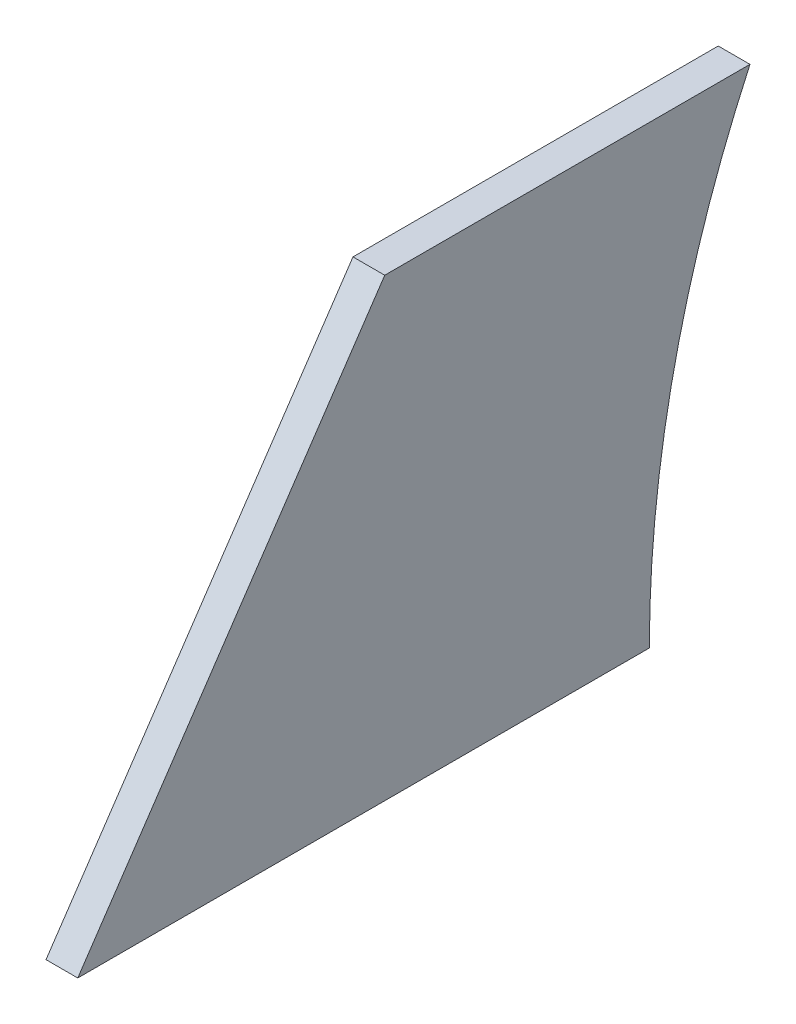
ISO-10303-21;
HEADER;
FILE_DESCRIPTION(('STEP AP214'),'2;1');
FILE_NAME('part.step','',(''),(''),'','','');
FILE_SCHEMA(('AUTOMOTIVE_DESIGN { 1 0 10303 214 1 1 1 1 }'));
ENDSEC;
DATA;
#1=APPLICATION_CONTEXT('core data for automotive mechanical design processes');
#2=APPLICATION_PROTOCOL_DEFINITION('international standard','automotive_design',2000,#1);
#3=PRODUCT_CONTEXT('',#1,'mechanical');
#4=PRODUCT('Part','Part','',(#3));
#5=PRODUCT_RELATED_PRODUCT_CATEGORY('part','',(#4));
#6=PRODUCT_DEFINITION_FORMATION('','',#4);
#7=PRODUCT_DEFINITION_CONTEXT('part definition',#1,'design');
#8=PRODUCT_DEFINITION('design','',#6,#7);
#9=PRODUCT_DEFINITION_SHAPE('','',#8);
#10=(LENGTH_UNIT() NAMED_UNIT(*) SI_UNIT(.MILLI.,.METRE.));
#11=(NAMED_UNIT(*) PLANE_ANGLE_UNIT() SI_UNIT($,.RADIAN.));
#12=(NAMED_UNIT(*) SI_UNIT($,.STERADIAN.) SOLID_ANGLE_UNIT());
#13=UNCERTAINTY_MEASURE_WITH_UNIT(LENGTH_MEASURE(1.E-05),#10,'distance_accuracy_value','');
#14=(GEOMETRIC_REPRESENTATION_CONTEXT(3) GLOBAL_UNCERTAINTY_ASSIGNED_CONTEXT((#13)) GLOBAL_UNIT_ASSIGNED_CONTEXT((#10,
#11,#12)) REPRESENTATION_CONTEXT('',''));
#15=CARTESIAN_POINT('',(0.,0.,0.));
#16=DIRECTION('',(0.,0.,1.));
#17=DIRECTION('',(1.,0.,0.));
#18=AXIS2_PLACEMENT_3D('',#15,#16,#17);
#19=CARTESIAN_POINT('',(3.,0.,0.));
#20=DIRECTION('',(0.,-0.559141668277782,-0.829072128825676));
#21=DIRECTION('',(0.,0.829072128825676,-0.559141668277782));
#22=AXIS2_PLACEMENT_3D('',#19,#20,#21);
#23=PLANE('',#22);
#24=DIRECTION('',(0.,-0.829072128825676,0.559141668277782));
#25=VECTOR('',#24,1.);
#26=CARTESIAN_POINT('',(0.,0.,0.));
#27=LINE('',#26,#25);
#28=CARTESIAN_POINT('',(0.,43.,-29.));
#29=VERTEX_POINT('',#28);
#30=CARTESIAN_POINT('',(0.,0.,0.));
#31=VERTEX_POINT('',#30);
#32=EDGE_CURVE('E99',#29,#31,#27,.T.);
#33=ORIENTED_EDGE('',*,*,#32,.T.);
#34=DIRECTION('',(-1.,0.,0.));
#35=VECTOR('',#34,1.);
#36=CARTESIAN_POINT('',(3.,0.,0.));
#37=LINE('',#36,#35);
#38=CARTESIAN_POINT('',(3.,0.,0.));
#39=VERTEX_POINT('',#38);
#40=EDGE_CURVE('E11',#39,#31,#37,.T.);
#41=ORIENTED_EDGE('',*,*,#40,.F.);
#42=DIRECTION('',(0.,-0.829072128825676,0.559141668277782));
#43=VECTOR('',#42,1.);
#44=CARTESIAN_POINT('',(3.,0.,0.));
#45=LINE('',#44,#43);
#46=CARTESIAN_POINT('',(3.,43.,-29.));
#47=VERTEX_POINT('',#46);
#48=EDGE_CURVE('E87',#47,#39,#45,.T.);
#49=ORIENTED_EDGE('',*,*,#48,.F.);
#50=DIRECTION('',(-1.,0.,0.));
#51=VECTOR('',#50,1.);
#52=CARTESIAN_POINT('',(3.,43.,-29.));
#53=LINE('',#52,#51);
#54=EDGE_CURVE('E95',#47,#29,#53,.T.);
#55=ORIENTED_EDGE('',*,*,#54,.T.);
#56=EDGE_LOOP('',(#33,#41,#49,#55));
#57=FACE_BOUND('',#56,.T.);
#58=ADVANCED_FACE('F36',(#57),#23,.F.);
#59=CARTESIAN_POINT('',(3.,0.,0.));
#60=DIRECTION('',(0.,1.,0.));
#61=DIRECTION('',(0.,0.,1.));
#62=AXIS2_PLACEMENT_3D('',#59,#60,#61);
#63=PLANE('',#62);
#64=DIRECTION('',(0.,0.,-1.));
#65=VECTOR('',#64,1.);
#66=CARTESIAN_POINT('',(0.,0.,0.));
#67=LINE('',#66,#65);
#68=CARTESIAN_POINT('',(0.,0.,-54.));
#69=VERTEX_POINT('',#68);
#70=EDGE_CURVE('E91',#31,#69,#67,.T.);
#71=ORIENTED_EDGE('',*,*,#70,.T.);
#72=DIRECTION('',(-1.,0.,0.));
#73=VECTOR('',#72,1.);
#74=CARTESIAN_POINT('',(3.,0.,-54.));
#75=LINE('',#74,#73);
#76=CARTESIAN_POINT('',(3.,0.,-54.));
#77=VERTEX_POINT('',#76);
#78=EDGE_CURVE('E44',#77,#69,#75,.T.);
#79=ORIENTED_EDGE('',*,*,#78,.F.);
#80=DIRECTION('',(0.,0.,-1.));
#81=VECTOR('',#80,1.);
#82=CARTESIAN_POINT('',(3.,0.,0.));
#83=LINE('',#82,#81);
#84=EDGE_CURVE('E82',#39,#77,#83,.T.);
#85=ORIENTED_EDGE('',*,*,#84,.F.);
#86=ORIENTED_EDGE('',*,*,#40,.T.);
#87=EDGE_LOOP('',(#71,#79,#85,#86));
#88=FACE_BOUND('',#87,.T.);
#89=ADVANCED_FACE('F90',(#88),#63,.F.);
#90=CARTESIAN_POINT('',(3.,0.,-156.));
#91=DIRECTION('',(-1.,0.,0.));
#92=DIRECTION('',(0.,0.,1.));
#93=AXIS2_PLACEMENT_3D('',#90,#91,#92);
#94=CYLINDRICAL_SURFACE('',#93,102.);
#95=CARTESIAN_POINT('',(0.,0.,-156.));
#96=DIRECTION('',(-1.,0.,0.));
#97=DIRECTION('',(0.,0.,-1.));
#98=AXIS2_PLACEMENT_3D('',#95,#96,#97);
#99=CIRCLE('',#98,102.);
#100=CARTESIAN_POINT('',(0.,43.,-63.5067570035519));
#101=VERTEX_POINT('',#100);
#102=EDGE_CURVE('E69',#69,#101,#99,.T.);
#103=ORIENTED_EDGE('',*,*,#102,.T.);
#104=DIRECTION('',(-1.,0.,0.));
#105=VECTOR('',#104,1.);
#106=CARTESIAN_POINT('',(3.,43.,-63.5067570035519));
#107=LINE('',#106,#105);
#108=CARTESIAN_POINT('',(3.,43.,-63.5067570035519));
#109=VERTEX_POINT('',#108);
#110=EDGE_CURVE('E92',#109,#101,#107,.T.);
#111=ORIENTED_EDGE('',*,*,#110,.F.);
#112=CARTESIAN_POINT('',(3.,0.,-156.));
#113=DIRECTION('',(-1.,0.,0.));
#114=DIRECTION('',(0.,0.,-1.));
#115=AXIS2_PLACEMENT_3D('',#112,#113,#114);
#116=CIRCLE('',#115,102.);
#117=EDGE_CURVE('E85',#77,#109,#116,.T.);
#118=ORIENTED_EDGE('',*,*,#117,.F.);
#119=ORIENTED_EDGE('',*,*,#78,.T.);
#120=EDGE_LOOP('',(#103,#111,#118,#119));
#121=FACE_BOUND('',#120,.T.);
#122=ADVANCED_FACE('F93',(#121),#94,.F.);
#123=CARTESIAN_POINT('',(3.,43.,-29.));
#124=DIRECTION('',(0.,-1.,0.));
#125=DIRECTION('',(0.,0.,-1.));
#126=AXIS2_PLACEMENT_3D('',#123,#124,#125);
#127=PLANE('',#126);
#128=DIRECTION('',(0.,0.,1.));
#129=VECTOR('',#128,1.);
#130=CARTESIAN_POINT('',(0.,43.,-29.));
#131=LINE('',#130,#129);
#132=EDGE_CURVE('E75',#101,#29,#131,.T.);
#133=ORIENTED_EDGE('',*,*,#132,.T.);
#134=ORIENTED_EDGE('',*,*,#54,.F.);
#135=DIRECTION('',(0.,0.,1.));
#136=VECTOR('',#135,1.);
#137=CARTESIAN_POINT('',(3.,43.,-29.));
#138=LINE('',#137,#136);
#139=EDGE_CURVE('E52',#109,#47,#138,.T.);
#140=ORIENTED_EDGE('',*,*,#139,.F.);
#141=ORIENTED_EDGE('',*,*,#110,.T.);
#142=EDGE_LOOP('',(#133,#134,#140,#141));
#143=FACE_BOUND('',#142,.T.);
#144=ADVANCED_FACE('F106',(#143),#127,.F.);
#145=CARTESIAN_POINT('',(3.,0.,-156.));
#146=DIRECTION('',(1.,0.,0.));
#147=DIRECTION('',(0.,0.,-1.));
#148=AXIS2_PLACEMENT_3D('',#145,#146,#147);
#149=PLANE('',#148);
#150=ORIENTED_EDGE('',*,*,#48,.T.);
#151=ORIENTED_EDGE('',*,*,#84,.T.);
#152=ORIENTED_EDGE('',*,*,#117,.T.);
#153=ORIENTED_EDGE('',*,*,#139,.T.);
#154=EDGE_LOOP('',(#150,#151,#152,#153));
#155=FACE_BOUND('',#154,.T.);
#156=ADVANCED_FACE('F83',(#155),#149,.T.);
#157=CARTESIAN_POINT('',(0.,0.,-156.));
#158=DIRECTION('',(1.,0.,0.));
#159=DIRECTION('',(0.,0.,-1.));
#160=AXIS2_PLACEMENT_3D('',#157,#158,#159);
#161=PLANE('',#160);
#162=ORIENTED_EDGE('',*,*,#32,.F.);
#163=ORIENTED_EDGE('',*,*,#132,.F.);
#164=ORIENTED_EDGE('',*,*,#102,.F.);
#165=ORIENTED_EDGE('',*,*,#70,.F.);
#166=EDGE_LOOP('',(#162,#163,#164,#165));
#167=FACE_BOUND('',#166,.T.);
#168=ADVANCED_FACE('F109',(#167),#161,.F.);
#169=CLOSED_SHELL('',(#58,#89,#122,#144,#156,#168));
#170=MANIFOLD_SOLID_BREP('B2',#169);
#171=ADVANCED_BREP_SHAPE_REPRESENTATION('',(#18,#170),#14);
#172=SHAPE_DEFINITION_REPRESENTATION(#9,#171);
ENDSEC;
END-ISO-10303-21;
